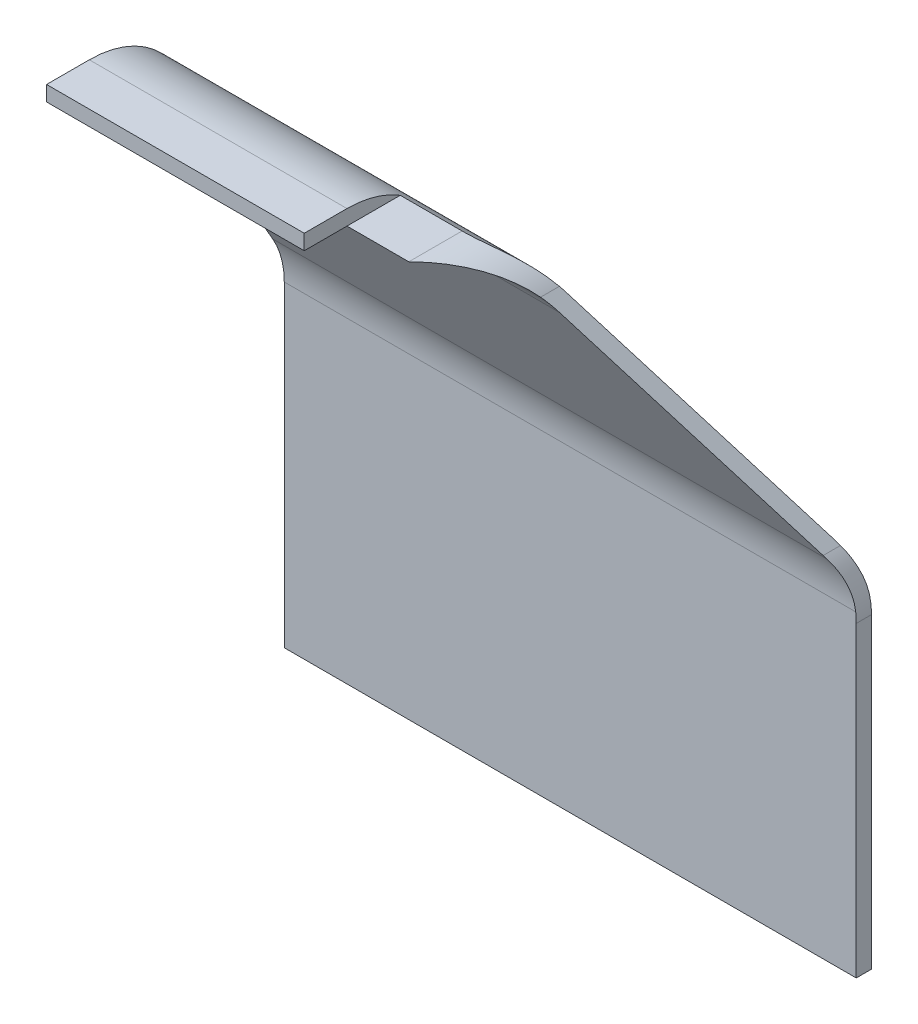
ISO-10303-21;
HEADER;
FILE_DESCRIPTION(('STEP AP214'),'2;1');
FILE_NAME('part.step','',(''),(''),'','','');
FILE_SCHEMA(('AUTOMOTIVE_DESIGN { 1 0 10303 214 1 1 1 1 }'));
ENDSEC;
DATA;
#1=APPLICATION_CONTEXT('core data for automotive mechanical design processes');
#2=APPLICATION_PROTOCOL_DEFINITION('international standard','automotive_design',2000,#1);
#3=PRODUCT_CONTEXT('',#1,'mechanical');
#4=PRODUCT('Part','Part','',(#3));
#5=PRODUCT_RELATED_PRODUCT_CATEGORY('part','',(#4));
#6=PRODUCT_DEFINITION_FORMATION('','',#4);
#7=PRODUCT_DEFINITION_CONTEXT('part definition',#1,'design');
#8=PRODUCT_DEFINITION('design','',#6,#7);
#9=PRODUCT_DEFINITION_SHAPE('','',#8);
#10=(LENGTH_UNIT() NAMED_UNIT(*) SI_UNIT(.MILLI.,.METRE.));
#11=(NAMED_UNIT(*) PLANE_ANGLE_UNIT() SI_UNIT($,.RADIAN.));
#12=(NAMED_UNIT(*) SI_UNIT($,.STERADIAN.) SOLID_ANGLE_UNIT());
#13=UNCERTAINTY_MEASURE_WITH_UNIT(LENGTH_MEASURE(1.E-05),#10,'distance_accuracy_value','');
#14=(GEOMETRIC_REPRESENTATION_CONTEXT(3) GLOBAL_UNCERTAINTY_ASSIGNED_CONTEXT((#13)) GLOBAL_UNIT_ASSIGNED_CONTEXT((#10,
#11,#12)) REPRESENTATION_CONTEXT('',''));
#15=CARTESIAN_POINT('',(0.,0.,0.));
#16=DIRECTION('',(0.,0.,1.));
#17=DIRECTION('',(1.,0.,0.));
#18=AXIS2_PLACEMENT_3D('',#15,#16,#17);
#19=CARTESIAN_POINT('',(58.05,119.961524227066,46.9999999999999));
#20=DIRECTION('',(0.,-1.,0.));
#21=DIRECTION('',(0.,0.,1.));
#22=AXIS2_PLACEMENT_3D('',#19,#20,#21);
#23=PLANE('',#22);
#24=DIRECTION('',(0.,0.,-1.));
#25=VECTOR('',#24,1.);
#26=CARTESIAN_POINT('',(-7.10089581434053,119.961524227066,50.));
#27=LINE('',#26,#25);
#28=CARTESIAN_POINT('',(-7.10089581434053,119.961524227066,46.9999999999999));
#29=VERTEX_POINT('',#28);
#30=CARTESIAN_POINT('',(-7.10089581434053,119.961524227066,38.5470053837924));
#31=VERTEX_POINT('',#30);
#32=EDGE_CURVE('E415',#29,#31,#27,.T.);
#33=ORIENTED_EDGE('',*,*,#32,.T.);
#34=DIRECTION('',(-1.,0.,0.));
#35=VECTOR('',#34,1.);
#36=CARTESIAN_POINT('',(58.05,119.961524227066,38.5470053837924));
#37=LINE('',#36,#35);
#38=CARTESIAN_POINT('',(-58.05,119.961524227066,38.5470053837924));
#39=VERTEX_POINT('',#38);
#40=EDGE_CURVE('E474',#39,#31,#37,.F.);
#41=ORIENTED_EDGE('',*,*,#40,.F.);
#42=DIRECTION('',(0.,0.,-1.));
#43=VECTOR('',#42,1.);
#44=CARTESIAN_POINT('',(-58.05,119.961524227066,46.9999999999999));
#45=LINE('',#44,#43);
#46=CARTESIAN_POINT('',(-58.05,119.961524227066,46.9999999999999));
#47=VERTEX_POINT('',#46);
#48=EDGE_CURVE('E525',#47,#39,#45,.T.);
#49=ORIENTED_EDGE('',*,*,#48,.F.);
#50=DIRECTION('',(-1.,0.,0.));
#51=VECTOR('',#50,1.);
#52=CARTESIAN_POINT('',(58.05,119.961524227066,46.9999999999999));
#53=LINE('',#52,#51);
#54=EDGE_CURVE('E443',#29,#47,#53,.T.);
#55=ORIENTED_EDGE('',*,*,#54,.F.);
#56=EDGE_LOOP('',(#33,#41,#49,#55));
#57=FACE_BOUND('',#56,.T.);
#58=ADVANCED_FACE('F50',(#57),#23,.F.);
#59=CARTESIAN_POINT('',(58.05,0.,0.));
#60=DIRECTION('',(0.,0.,-1.));
#61=DIRECTION('',(1.,0.,0.));
#62=AXIS2_PLACEMENT_3D('',#59,#60,#61);
#63=PLANE('',#62);
#64=DIRECTION('',(0.,1.,0.));
#65=VECTOR('',#64,1.);
#66=CARTESIAN_POINT('',(55.05,0.,0.));
#67=LINE('',#66,#65);
#68=CARTESIAN_POINT('',(55.05,0.,0.));
#69=VERTEX_POINT('',#68);
#70=CARTESIAN_POINT('',(55.05,60.720595314676,0.));
#71=VERTEX_POINT('',#70);
#72=EDGE_CURVE('E431',#69,#71,#67,.T.);
#73=ORIENTED_EDGE('',*,*,#72,.T.);
#74=CARTESIAN_POINT('',(38.05,60.720595314676,0.));
#75=DIRECTION('',(0.,0.,1.));
#76=DIRECTION('',(1.,0.,0.));
#77=AXIS2_PLACEMENT_3D('',#74,#75,#76);
#78=CIRCLE('',#77,17.);
#79=CARTESIAN_POINT('',(54.9411806517473,62.6410161513776,0.));
#80=VERTEX_POINT('',#79);
#81=EDGE_CURVE('E194',#71,#80,#78,.T.);
#82=ORIENTED_EDGE('',*,*,#81,.T.);
#83=DIRECTION('',(-1.,0.,0.));
#84=VECTOR('',#83,1.);
#85=CARTESIAN_POINT('',(58.05,62.6410161513776,0.));
#86=LINE('',#85,#84);
#87=CARTESIAN_POINT('',(-58.05,62.6410161513776,0.));
#88=VERTEX_POINT('',#87);
#89=EDGE_CURVE('E487',#88,#80,#86,.F.);
#90=ORIENTED_EDGE('',*,*,#89,.F.);
#91=DIRECTION('',(0.,1.,0.));
#92=VECTOR('',#91,1.);
#93=CARTESIAN_POINT('',(-58.05,0.,0.));
#94=LINE('',#93,#92);
#95=CARTESIAN_POINT('',(-58.05,0.,0.));
#96=VERTEX_POINT('',#95);
#97=EDGE_CURVE('E514',#96,#88,#94,.T.);
#98=ORIENTED_EDGE('',*,*,#97,.F.);
#99=DIRECTION('',(-1.,0.,0.));
#100=VECTOR('',#99,1.);
#101=CARTESIAN_POINT('',(58.05,0.,0.));
#102=LINE('',#101,#100);
#103=EDGE_CURVE('E454',#69,#96,#102,.T.);
#104=ORIENTED_EDGE('',*,*,#103,.F.);
#105=EDGE_LOOP('',(#73,#82,#90,#98,#104));
#106=FACE_BOUND('',#105,.T.);
#107=ADVANCED_FACE('F257',(#106),#63,.F.);
#108=CARTESIAN_POINT('',(58.05,67.1961524227066,0.));
#109=DIRECTION('',(0.,0.499999999999998,-0.86602540378444));
#110=DIRECTION('',(0.,-0.86602540378444,-0.499999999999998));
#111=AXIS2_PLACEMENT_3D('',#108,#109,#110);
#112=PLANE('',#111);
#113=CARTESIAN_POINT('',(38.05,60.720595314676,-3.73866463947428));
#114=DIRECTION('',(0.,-0.499999999999998,0.86602540378444));
#115=DIRECTION('',(0.,-0.86602540378444,-0.499999999999998));
#116=AXIS2_PLACEMENT_3D('',#113,#114,#115);
#117=ELLIPSE('',#116,19.6299091524473,17.);
#118=CARTESIAN_POINT('',(51.481858753949,71.1410161513775,2.27756813566452));
#119=VERTEX_POINT('',#118);
#120=CARTESIAN_POINT('',(51.0727555330226,71.6479846793471,2.57026655175842));
#121=VERTEX_POINT('',#120);
#122=EDGE_CURVE('E170',#119,#121,#117,.T.);
#123=ORIENTED_EDGE('',*,*,#122,.T.);
#124=DIRECTION('',(-0.587858883152554,0.700582935935479,0.404481746652004));
#125=VECTOR('',#124,1.);
#126=CARTESIAN_POINT('',(55.9285514772247,65.8610724179399,-0.770808800141765));
#127=LINE('',#126,#125);
#128=CARTESIAN_POINT('',(20.1825280762013,108.461524227066,23.8245735194569));
#129=VERTEX_POINT('',#128);
#130=EDGE_CURVE('E178',#121,#129,#127,.T.);
#131=ORIENTED_EDGE('',*,*,#130,.T.);
#132=DIRECTION('',(-1.,0.,0.));
#133=VECTOR('',#132,1.);
#134=CARTESIAN_POINT('',(58.05,108.461524227066,23.8245735194569));
#135=LINE('',#134,#133);
#136=CARTESIAN_POINT('',(-58.05,108.461524227066,23.8245735194569));
#137=VERTEX_POINT('',#136);
#138=EDGE_CURVE('E482',#137,#129,#135,.F.);
#139=ORIENTED_EDGE('',*,*,#138,.F.);
#140=DIRECTION('',(0.,0.86602540378444,0.499999999999998));
#141=VECTOR('',#140,1.);
#142=CARTESIAN_POINT('',(-58.05,67.1961524227066,0.));
#143=LINE('',#142,#141);
#144=CARTESIAN_POINT('',(-58.05,71.1410161513775,2.27756813566452));
#145=VERTEX_POINT('',#144);
#146=EDGE_CURVE('E506',#145,#137,#143,.T.);
#147=ORIENTED_EDGE('',*,*,#146,.F.);
#148=DIRECTION('',(-1.,0.,0.));
#149=VECTOR('',#148,1.);
#150=CARTESIAN_POINT('',(-58.05,71.1410161513775,2.27756813566452));
#151=LINE('',#150,#149);
#152=EDGE_CURVE('E192',#119,#145,#151,.T.);
#153=ORIENTED_EDGE('',*,*,#152,.F.);
#154=EDGE_LOOP('',(#123,#131,#139,#147,#153));
#155=FACE_BOUND('',#154,.T.);
#156=ADVANCED_FACE('F188',(#155),#112,.F.);
#157=CARTESIAN_POINT('',(58.05,116.961524227066,46.9999999999999));
#158=DIRECTION('',(0.,0.,-1.));
#159=DIRECTION('',(0.,-1.,0.));
#160=AXIS2_PLACEMENT_3D('',#157,#158,#159);
#161=PLANE('',#160);
#162=DIRECTION('',(0.,1.,0.));
#163=VECTOR('',#162,1.);
#164=CARTESIAN_POINT('',(-7.10089581434053,116.961524227066,46.9999999999999));
#165=LINE('',#164,#163);
#166=CARTESIAN_POINT('',(-7.10089581434053,116.961524227066,46.9999999999999));
#167=VERTEX_POINT('',#166);
#168=EDGE_CURVE('E407',#167,#29,#165,.T.);
#169=ORIENTED_EDGE('',*,*,#168,.T.);
#170=ORIENTED_EDGE('',*,*,#54,.T.);
#171=DIRECTION('',(0.,1.,0.));
#172=VECTOR('',#171,1.);
#173=CARTESIAN_POINT('',(-58.05,116.961524227066,46.9999999999999));
#174=LINE('',#173,#172);
#175=CARTESIAN_POINT('',(-58.05,116.961524227066,46.9999999999999));
#176=VERTEX_POINT('',#175);
#177=EDGE_CURVE('E517',#176,#47,#174,.T.);
#178=ORIENTED_EDGE('',*,*,#177,.F.);
#179=DIRECTION('',(-1.,0.,0.));
#180=VECTOR('',#179,1.);
#181=CARTESIAN_POINT('',(58.05,116.961524227066,46.9999999999999));
#182=LINE('',#181,#180);
#183=EDGE_CURVE('E446',#167,#176,#182,.T.);
#184=ORIENTED_EDGE('',*,*,#183,.F.);
#185=EDGE_LOOP('',(#169,#170,#178,#184));
#186=FACE_BOUND('',#185,.T.);
#187=ADVANCED_FACE('F267',(#186),#161,.F.);
#188=CARTESIAN_POINT('',(58.05,119.961524227066,26.9999999999999));
#189=DIRECTION('',(0.,-0.499999999999998,0.86602540378444));
#190=DIRECTION('',(0.,0.86602540378444,0.499999999999998));
#191=AXIS2_PLACEMENT_3D('',#188,#189,#190);
#192=PLANE('',#191);
#193=DIRECTION('',(0.587858883152554,-0.700582935935479,-0.404481746652004));
#194=VECTOR('',#193,1.);
#195=CARTESIAN_POINT('',(26.9537559720427,100.391889055923,15.7014658659976));
#196=LINE('',#195,#194);
#197=CARTESIAN_POINT('',(18.9238786294354,109.961524227066,21.2264973081036));
#198=VERTEX_POINT('',#197);
#199=CARTESIAN_POINT('',(50.2395031910945,72.6410161513775,-0.320508075688807));
#200=VERTEX_POINT('',#199);
#201=EDGE_CURVE('E531',#198,#200,#196,.T.);
#202=ORIENTED_EDGE('',*,*,#201,.T.);
#203=DIRECTION('',(-1.,0.,0.));
#204=VECTOR('',#203,1.);
#205=CARTESIAN_POINT('',(58.05,72.6410161513775,-0.320508075688803));
#206=LINE('',#205,#204);
#207=CARTESIAN_POINT('',(-58.05,72.6410161513775,-0.320508075688803));
#208=VERTEX_POINT('',#207);
#209=EDGE_CURVE('E464',#208,#200,#206,.F.);
#210=ORIENTED_EDGE('',*,*,#209,.F.);
#211=DIRECTION('',(0.,-0.86602540378444,-0.499999999999998));
#212=VECTOR('',#211,1.);
#213=CARTESIAN_POINT('',(-58.05,119.961524227066,26.9999999999999));
#214=LINE('',#213,#212);
#215=CARTESIAN_POINT('',(-58.05,109.961524227066,21.2264973081036));
#216=VERTEX_POINT('',#215);
#217=EDGE_CURVE('E448',#216,#208,#214,.T.);
#218=ORIENTED_EDGE('',*,*,#217,.F.);
#219=DIRECTION('',(-1.,0.,0.));
#220=VECTOR('',#219,1.);
#221=CARTESIAN_POINT('',(58.05,109.961524227066,21.2264973081036));
#222=LINE('',#221,#220);
#223=EDGE_CURVE('E469',#198,#216,#222,.T.);
#224=ORIENTED_EDGE('',*,*,#223,.F.);
#225=EDGE_LOOP('',(#202,#210,#218,#224));
#226=FACE_BOUND('',#225,.T.);
#227=ADVANCED_FACE('F270',(#226),#192,.F.);
#228=CARTESIAN_POINT('',(58.05,68.,-3.));
#229=DIRECTION('',(0.,0.,1.));
#230=DIRECTION('',(0.,1.,0.));
#231=AXIS2_PLACEMENT_3D('',#228,#229,#230);
#232=PLANE('',#231);
#233=DIRECTION('',(0.,-1.,0.));
#234=VECTOR('',#233,1.);
#235=CARTESIAN_POINT('',(55.05,68.,-3.));
#236=LINE('',#235,#234);
#237=CARTESIAN_POINT('',(55.05,60.720595314676,-3.));
#238=VERTEX_POINT('',#237);
#239=CARTESIAN_POINT('',(55.05,0.,-3.));
#240=VERTEX_POINT('',#239);
#241=EDGE_CURVE('E11',#238,#240,#236,.T.);
#242=ORIENTED_EDGE('',*,*,#241,.T.);
#243=DIRECTION('',(-1.,0.,0.));
#244=VECTOR('',#243,1.);
#245=CARTESIAN_POINT('',(58.05,0.,-3.));
#246=LINE('',#245,#244);
#247=CARTESIAN_POINT('',(-58.05,0.,-3.));
#248=VERTEX_POINT('',#247);
#249=EDGE_CURVE('E437',#240,#248,#246,.T.);
#250=ORIENTED_EDGE('',*,*,#249,.T.);
#251=DIRECTION('',(0.,-1.,0.));
#252=VECTOR('',#251,1.);
#253=CARTESIAN_POINT('',(-58.05,68.,-3.));
#254=LINE('',#253,#252);
#255=CARTESIAN_POINT('',(-58.05,62.6410161513776,-3.));
#256=VERTEX_POINT('',#255);
#257=EDGE_CURVE('E445',#256,#248,#254,.T.);
#258=ORIENTED_EDGE('',*,*,#257,.F.);
#259=DIRECTION('',(-1.,0.,0.));
#260=VECTOR('',#259,1.);
#261=CARTESIAN_POINT('',(58.05,62.6410161513776,-3.));
#262=LINE('',#261,#260);
#263=CARTESIAN_POINT('',(54.9411806517473,62.6410161513776,-3.));
#264=VERTEX_POINT('',#263);
#265=EDGE_CURVE('E428',#264,#256,#262,.T.);
#266=ORIENTED_EDGE('',*,*,#265,.F.);
#267=CARTESIAN_POINT('',(38.05,60.720595314676,-3.));
#268=DIRECTION('',(0.,0.,-1.));
#269=DIRECTION('',(0.,1.,0.));
#270=AXIS2_PLACEMENT_3D('',#267,#268,#269);
#271=CIRCLE('',#270,17.);
#272=EDGE_CURVE('E213',#264,#238,#271,.T.);
#273=ORIENTED_EDGE('',*,*,#272,.T.);
#274=EDGE_LOOP('',(#242,#250,#258,#266,#273));
#275=FACE_BOUND('',#274,.T.);
#276=ADVANCED_FACE('F225',(#275),#232,.F.);
#277=CARTESIAN_POINT('',(58.05,62.6410161513776,17.));
#278=DIRECTION('',(-1.,0.,0.));
#279=DIRECTION('',(0.,0.,-1.));
#280=AXIS2_PLACEMENT_3D('',#277,#278,#279);
#281=CYLINDRICAL_SURFACE('',#280,20.);
#282=ORIENTED_EDGE('',*,*,#265,.T.);
#283=CARTESIAN_POINT('',(-58.05,62.6410161513776,17.));
#284=DIRECTION('',(-1.,0.,0.));
#285=DIRECTION('',(0.,0.,1.));
#286=AXIS2_PLACEMENT_3D('',#283,#284,#285);
#287=CIRCLE('',#286,20.);
#288=EDGE_CURVE('E459',#256,#208,#287,.F.);
#289=ORIENTED_EDGE('',*,*,#288,.T.);
#290=ORIENTED_EDGE('',*,*,#209,.T.);
#291=CARTESIAN_POINT('',(58.6304995028672,62.6410161513776,17.));
#292=DIRECTION('',(-0.766044443118979,-0.642787609686538,0.));
#293=DIRECTION('',(-0.642787609686538,0.766044443118979,0.));
#294=AXIS2_PLACEMENT_3D('',#291,#292,#293);
#295=ELLIPSE('',#294,26.1081457866455,20.);
#296=CARTESIAN_POINT('',(51.0727555330226,71.6479846793471,-0.85705793058212));
#297=VERTEX_POINT('',#296);
#298=EDGE_CURVE('E534',#297,#200,#295,.F.);
#299=ORIENTED_EDGE('',*,*,#298,.F.);
#300=CARTESIAN_POINT('',(54.9411806517473,62.6410161513776,-3.));
#301=CARTESIAN_POINT('',(54.9170234972303,62.8535184775621,-3.00000357667472));
#302=CARTESIAN_POINT('',(54.8888533776891,63.0655267125537,-2.99661216506532));
#303=CARTESIAN_POINT('',(54.824580195839,63.4881078919754,-2.98317057057549));
#304=CARTESIAN_POINT('',(54.7884777819027,63.6986809522647,-2.97312093179239));
#305=CARTESIAN_POINT('',(54.6685017568662,64.3271201383131,-2.9332129072196));
#306=CARTESIAN_POINT('',(54.5729002888905,64.7422239264023,-2.89359476742512));
#307=CARTESIAN_POINT('',(54.354889800864,65.5497479674667,-2.79142291733916));
#308=CARTESIAN_POINT('',(54.2333006183854,65.9424780050369,-2.72953798450622));
#309=CARTESIAN_POINT('',(53.963458091383,66.7146869614383,-2.58467596176691));
#310=CARTESIAN_POINT('',(53.8152017061546,67.0941643632509,-2.50169646612515));
#311=CARTESIAN_POINT('',(53.4901222962929,67.8462056093782,-2.31475098770334));
#312=CARTESIAN_POINT('',(53.3127193683904,68.2184082416264,-2.21034518681169));
#313=CARTESIAN_POINT('',(52.9338048223089,68.944966690242,-1.98433634559897));
#314=CARTESIAN_POINT('',(52.7322866952215,69.2993176514444,-1.86272866071539));
#315=CARTESIAN_POINT('',(52.3007353728827,69.999095098478,-1.60113655054436));
#316=CARTESIAN_POINT('',(52.0700319862102,70.343942051001,-1.46071289641755));
#317=CARTESIAN_POINT('',(51.5871082370338,71.0121681836264,-1.16747322146933));
#318=CARTESIAN_POINT('',(51.3349071206428,71.3355661143954,-1.01466829107672));
#319=CARTESIAN_POINT('',(51.0727555330226,71.6479846793471,-0.857057930582132));
#320=B_SPLINE_CURVE_WITH_KNOTS('',3,(#300,#301,#302,#303,#304,#305,#306,#307,#308,#309,#310,
#311,#312,#313,#314,#315,#316,#317,#318,#319),.UNSPECIFIED.,.F.,.F.,(4,2,2,2,2,2,2,2,2,4),(0.,
0.641475359483342,1.28289830531581,2.56418783680744,3.80982948115352,5.05561324883391,
6.33012444124597,7.60498041485882,8.917780659416,10.2294177048095),.UNSPECIFIED.);
#321=EDGE_CURVE('E169',#264,#297,#320,.T.);
#322=ORIENTED_EDGE('',*,*,#321,.F.);
#323=EDGE_LOOP('',(#282,#289,#290,#299,#322));
#324=FACE_BOUND('',#323,.T.);
#325=ADVANCED_FACE('F218',(#324),#281,.T.);
#326=CARTESIAN_POINT('',(58.05,99.9615242270664,38.5470053837924));
#327=DIRECTION('',(-1.,0.,0.));
#328=DIRECTION('',(0.,0.,-1.));
#329=AXIS2_PLACEMENT_3D('',#326,#327,#328);
#330=CYLINDRICAL_SURFACE('',#329,20.);
#331=ORIENTED_EDGE('',*,*,#223,.T.);
#332=CARTESIAN_POINT('',(-58.05,99.9615242270664,38.5470053837924));
#333=DIRECTION('',(-1.,0.,0.));
#334=DIRECTION('',(0.,0.,1.));
#335=AXIS2_PLACEMENT_3D('',#332,#333,#334);
#336=CIRCLE('',#335,20.);
#337=EDGE_CURVE('E472',#216,#39,#336,.F.);
#338=ORIENTED_EDGE('',*,*,#337,.T.);
#339=ORIENTED_EDGE('',*,*,#40,.T.);
#340=CARTESIAN_POINT('',(-7.10089581434053,99.9615242270664,38.5470053837924));
#341=DIRECTION('',(-1.,0.,0.));
#342=DIRECTION('',(0.,0.,1.));
#343=AXIS2_PLACEMENT_3D('',#340,#341,#342);
#344=CIRCLE('',#343,20.);
#345=CARTESIAN_POINT('',(-7.10089581434053,116.961524227066,28.0113516309396));
#346=VERTEX_POINT('',#345);
#347=EDGE_CURVE('E420',#346,#31,#344,.F.);
#348=ORIENTED_EDGE('',*,*,#347,.F.);
#349=DIRECTION('',(-1.,0.,0.));
#350=VECTOR('',#349,1.);
#351=CARTESIAN_POINT('',(58.05,116.961524227066,28.0113516309396));
#352=LINE('',#351,#350);
#353=CARTESIAN_POINT('',(5.12295102255945,116.961524227066,28.0113516309396));
#354=VERTEX_POINT('',#353);
#355=EDGE_CURVE('E236',#354,#346,#352,.T.);
#356=ORIENTED_EDGE('',*,*,#355,.F.);
#357=CARTESIAN_POINT('',(18.1457065555821,110.888913591738,21.7961199841225));
#358=CARTESIAN_POINT('',(17.972778249905,111.094989527594,21.9305500909026));
#359=CARTESIAN_POINT('',(17.7956916822672,111.296110651878,22.0671746936421));
#360=CARTESIAN_POINT('',(17.4335630988828,111.688422707841,22.3439978561942));
#361=CARTESIAN_POINT('',(17.2485222902922,111.879615136669,22.4841958723909));
#362=CARTESIAN_POINT('',(16.8707630686193,112.252141856973,22.7674150036979));
#363=CARTESIAN_POINT('',(16.6780434113733,112.433474539579,22.9104365743844));
#364=CARTESIAN_POINT('',(16.2851941285144,112.786266742225,23.1984595090999));
#365=CARTESIAN_POINT('',(16.0850640828763,112.957725701205,23.3434609850562));
#366=CARTESIAN_POINT('',(15.4695930179325,113.460779957492,23.783208531647));
#367=CARTESIAN_POINT('',(15.0430388159945,113.77724324659,24.0797689519088));
#368=CARTESIAN_POINT('',(14.1609366234529,114.369756970441,24.6697794463794));
#369=CARTESIAN_POINT('',(13.7053972946212,114.645819397763,24.9632304195049));
#370=CARTESIAN_POINT('',(12.9212017227899,115.071604165281,25.4416159918224));
#371=CARTESIAN_POINT('',(12.6008861265003,115.232759890445,25.6301074294751));
#372=CARTESIAN_POINT('',(11.9462929490265,115.536252243159,25.9977193918582));
#373=CARTESIAN_POINT('',(11.6120186193218,115.678593221501,26.176842077244));
#374=CARTESIAN_POINT('',(10.9296481350429,115.943259169988,26.5207380242418));
#375=CARTESIAN_POINT('',(10.5815902455362,116.065635304537,26.6855474426579));
#376=CARTESIAN_POINT('',(9.87033250912853,116.289451959786,26.9955852725736));
#377=CARTESIAN_POINT('',(9.50713918016764,116.390901382653,27.1408220010903));
#378=CARTESIAN_POINT('',(8.87348642909958,116.544850276085,27.3663886019316));
#379=CARTESIAN_POINT('',(8.60674938518821,116.603007384816,27.4533154409463));
#380=CARTESIAN_POINT('',(8.06623159738834,116.7070543585,27.6110030083615));
#381=CARTESIAN_POINT('',(7.79245356391383,116.752948868665,27.6817698568695));
#382=CARTESIAN_POINT('',(7.23967723270771,116.831531746706,27.8041872092603));
#383=CARTESIAN_POINT('',(6.96069816814034,116.864261393824,27.8558974229828));
#384=CARTESIAN_POINT('',(6.39846759019982,116.915951578616,27.9380567550627));
#385=CARTESIAN_POINT('',(6.11521932429452,116.934922091385,27.9685212755005));
#386=CARTESIAN_POINT('',(5.71324449035859,116.951682590625,27.9954850388907));
#387=CARTESIAN_POINT('',(5.59532233750887,116.955370293818,28.0014270793891));
#388=CARTESIAN_POINT('',(5.35925618644148,116.960291735124,28.0093623415644));
#389=CARTESIAN_POINT('',(5.24111212890804,116.961524680854,28.011354288172));
#390=CARTESIAN_POINT('',(5.12295102255945,116.961524227066,28.0113516309396));
#391=B_SPLINE_CURVE_WITH_KNOTS('',3,(#357,#358,#359,#360,#361,#362,#363,#364,#365,#366,#367,
#368,#369,#370,#371,#372,#373,#374,#375,#376,#377,#378,#379,#380,#381,#382,#383,#384,#385,#386,
#387,#388,#389,#390),.UNSPECIFIED.,.F.,.F.,(4,2,2,2,2,2,2,2,2,2,2,2,2,2,2,2,4),(0.,
0.902099599215312,1.80406277349486,2.70617268720864,3.6083338115817,5.43110430316127,
7.25333262228904,8.46795030381831,9.68228661941013,10.8934603052038,12.1041176935055,
12.9629603920171,13.821477288406,14.6772808648821,15.5324633791997,15.8867756345306,
16.2412022413564),.UNSPECIFIED.);
#392=CARTESIAN_POINT('',(18.1457065555821,110.888913591738,21.7961199841225));
#393=VERTEX_POINT('',#392);
#394=EDGE_CURVE('E186',#393,#354,#391,.T.);
#395=ORIENTED_EDGE('',*,*,#394,.F.);
#396=CARTESIAN_POINT('',(27.3148749412081,99.9615242270664,38.5470053837924));
#397=DIRECTION('',(-0.766044443118979,-0.642787609686538,0.));
#398=DIRECTION('',(-0.642787609686538,0.766044443118979,0.));
#399=AXIS2_PLACEMENT_3D('',#396,#397,#398);
#400=ELLIPSE('',#399,26.1081457866455,20.);
#401=EDGE_CURVE('E184',#198,#393,#400,.F.);
#402=ORIENTED_EDGE('',*,*,#401,.F.);
#403=EDGE_LOOP('',(#331,#338,#339,#348,#356,#395,#402));
#404=FACE_BOUND('',#403,.T.);
#405=ADVANCED_FACE('F221',(#404),#330,.T.);
#406=CARTESIAN_POINT('',(58.05,99.9615242270664,38.5470053837924));
#407=DIRECTION('',(1.,0.,0.));
#408=DIRECTION('',(0.,0.,1.));
#409=AXIS2_PLACEMENT_3D('',#406,#407,#408);
#410=CYLINDRICAL_SURFACE('',#409,17.);
#411=CARTESIAN_POINT('',(27.3148749412081,99.9615242270664,38.5470053837924));
#412=DIRECTION('',(-0.766044443118979,-0.642787609686538,0.));
#413=DIRECTION('',(0.642787609686538,-0.766044443118979,0.));
#414=AXIS2_PLACEMENT_3D('',#411,#412,#413);
#415=ELLIPSE('',#414,22.1919239186487,17.);
#416=CARTESIAN_POINT('',(18.1457065555821,110.888913591738,25.5242498507698));
#417=VERTEX_POINT('',#416);
#418=EDGE_CURVE('E60',#129,#417,#415,.F.);
#419=ORIENTED_EDGE('',*,*,#418,.T.);
#420=CARTESIAN_POINT('',(5.12295102255945,99.9615242270664,38.5470053837924));
#421=DIRECTION('',(-0.707106781186547,0.,-0.707106781186547));
#422=DIRECTION('',(0.707106781186547,0.,-0.707106781186547));
#423=AXIS2_PLACEMENT_3D('',#420,#421,#422);
#424=ELLIPSE('',#423,24.0416305603426,17.);
#425=CARTESIAN_POINT('',(5.12295102255945,116.961524227066,38.5470053837924));
#426=VERTEX_POINT('',#425);
#427=EDGE_CURVE('E501',#417,#426,#424,.F.);
#428=ORIENTED_EDGE('',*,*,#427,.T.);
#429=DIRECTION('',(-1.,0.,0.));
#430=VECTOR('',#429,1.);
#431=CARTESIAN_POINT('',(-58.05,116.961524227066,38.5470053837924));
#432=LINE('',#431,#430);
#433=CARTESIAN_POINT('',(-7.10089581434053,116.961524227066,38.5470053837924));
#434=VERTEX_POINT('',#433);
#435=EDGE_CURVE('E483',#426,#434,#432,.T.);
#436=ORIENTED_EDGE('',*,*,#435,.T.);
#437=CARTESIAN_POINT('',(-58.05,116.961524227066,38.5470053837924));
#438=VERTEX_POINT('',#437);
#439=EDGE_CURVE('E479',#434,#438,#432,.T.);
#440=ORIENTED_EDGE('',*,*,#439,.T.);
#441=CARTESIAN_POINT('',(-58.05,99.9615242270664,38.5470053837924));
#442=DIRECTION('',(-1.,0.,0.));
#443=DIRECTION('',(0.,0.,1.));
#444=AXIS2_PLACEMENT_3D('',#441,#442,#443);
#445=CIRCLE('',#444,17.);
#446=EDGE_CURVE('E484',#438,#137,#445,.T.);
#447=ORIENTED_EDGE('',*,*,#446,.T.);
#448=ORIENTED_EDGE('',*,*,#138,.T.);
#449=EDGE_LOOP('',(#419,#428,#436,#440,#447,#448));
#450=FACE_BOUND('',#449,.T.);
#451=ADVANCED_FACE('F228',(#450),#410,.F.);
#452=CARTESIAN_POINT('',(58.05,62.6410161513776,17.));
#453=DIRECTION('',(1.,0.,0.));
#454=DIRECTION('',(0.,0.,1.));
#455=AXIS2_PLACEMENT_3D('',#452,#453,#454);
#456=CYLINDRICAL_SURFACE('',#455,17.);
#457=CARTESIAN_POINT('',(54.9411806517473,62.6410161513776,0.));
#458=CARTESIAN_POINT('',(54.9184382254402,62.8410778656383,-3.28174206131976E-06));
#459=CARTESIAN_POINT('',(54.892137936733,63.0406983104257,0.00353262128909707));
#460=CARTESIAN_POINT('',(54.8325141446345,63.4386241561322,0.0175548554111907));
#461=CARTESIAN_POINT('',(54.7991912830339,63.636929675515,0.0280405515504049));
#462=CARTESIAN_POINT('',(54.6889161896901,64.2287656530385,0.0696952404371729));
#463=CARTESIAN_POINT('',(54.6015977232604,64.6197387489289,0.111062512932446));
#464=CARTESIAN_POINT('',(54.4034946007314,65.3803662258866,0.217883145646495));
#465=CARTESIAN_POINT('',(54.2934315122346,65.7503110806001,0.282633335977358));
#466=CARTESIAN_POINT('',(54.0500578327233,66.4777880431861,0.434455797684511));
#467=CARTESIAN_POINT('',(53.9167442835716,66.8353185646439,0.521530910106096));
#468=CARTESIAN_POINT('',(53.6250423660015,67.5447338879187,0.718339130426747));
#469=CARTESIAN_POINT('',(53.466106568663,67.8962491097505,0.828588125593773));
#470=CARTESIAN_POINT('',(53.1276366254354,68.5826150776642,1.06797038015978));
#471=CARTESIAN_POINT('',(52.9480963166759,68.9174607946847,1.19710929277729));
#472=CARTESIAN_POINT('',(52.5647350001669,69.5790950473409,1.47596172577744));
#473=CARTESIAN_POINT('',(52.3603482866846,69.9053428539206,1.62617518769987));
#474=CARTESIAN_POINT('',(51.9339098658808,70.5380531029711,1.9413906006558));
#475=CARTESIAN_POINT('',(51.7118761693912,70.8445351542652,2.10637749489704));
#476=CARTESIAN_POINT('',(51.481858753949,71.1410161513775,2.27756813566451));
#477=B_SPLINE_CURVE_WITH_KNOTS('',3,(#457,#458,#459,#460,#461,#462,#463,#464,#465,#466,#467,
#468,#469,#470,#471,#472,#473,#474,#475,#476),.UNSPECIFIED.,.F.,.F.,(4,2,2,2,2,2,2,2,2,4),(0.,
0.603917425499735,1.20777968308954,2.41393127787175,3.58647843572831,4.7591748847892,
5.96143624875916,7.16405815452336,8.40265831934531,9.6400101911576),.UNSPECIFIED.);
#478=EDGE_CURVE('E61',#80,#119,#477,.T.);
#479=ORIENTED_EDGE('',*,*,#478,.T.);
#480=ORIENTED_EDGE('',*,*,#152,.T.);
#481=CARTESIAN_POINT('',(-58.05,62.6410161513776,17.));
#482=DIRECTION('',(-1.,0.,0.));
#483=DIRECTION('',(0.,0.,1.));
#484=AXIS2_PLACEMENT_3D('',#481,#482,#483);
#485=CIRCLE('',#484,17.);
#486=EDGE_CURVE('E72',#145,#88,#485,.T.);
#487=ORIENTED_EDGE('',*,*,#486,.T.);
#488=ORIENTED_EDGE('',*,*,#89,.T.);
#489=EDGE_LOOP('',(#479,#480,#487,#488));
#490=FACE_BOUND('',#489,.T.);
#491=ADVANCED_FACE('F47',(#490),#456,.F.);
#492=CARTESIAN_POINT('',(58.05,0.,-3.));
#493=DIRECTION('',(0.,1.,0.));
#494=DIRECTION('',(0.,0.,-1.));
#495=AXIS2_PLACEMENT_3D('',#492,#493,#494);
#496=PLANE('',#495);
#497=ORIENTED_EDGE('',*,*,#103,.T.);
#498=DIRECTION('',(0.,0.,1.));
#499=VECTOR('',#498,1.);
#500=CARTESIAN_POINT('',(-58.05,0.,-3.));
#501=LINE('',#500,#499);
#502=EDGE_CURVE('E436',#248,#96,#501,.T.);
#503=ORIENTED_EDGE('',*,*,#502,.F.);
#504=ORIENTED_EDGE('',*,*,#249,.F.);
#505=DIRECTION('',(0.,0.,-1.));
#506=VECTOR('',#505,1.);
#507=CARTESIAN_POINT('',(55.05,0.,50.));
#508=LINE('',#507,#506);
#509=EDGE_CURVE('E191',#69,#240,#508,.T.);
#510=ORIENTED_EDGE('',*,*,#509,.F.);
#511=EDGE_LOOP('',(#497,#503,#504,#510));
#512=FACE_BOUND('',#511,.T.);
#513=ADVANCED_FACE('F222',(#512),#496,.F.);
#514=CARTESIAN_POINT('',(58.05,116.961524227066,28.7320508075687));
#515=DIRECTION('',(0.,1.,0.));
#516=DIRECTION('',(0.,0.,-1.));
#517=AXIS2_PLACEMENT_3D('',#514,#515,#516);
#518=PLANE('',#517);
#519=ORIENTED_EDGE('',*,*,#183,.T.);
#520=DIRECTION('',(0.,0.,1.));
#521=VECTOR('',#520,1.);
#522=CARTESIAN_POINT('',(-58.05,116.961524227066,28.7320508075687));
#523=LINE('',#522,#521);
#524=EDGE_CURVE('E512',#438,#176,#523,.T.);
#525=ORIENTED_EDGE('',*,*,#524,.F.);
#526=ORIENTED_EDGE('',*,*,#439,.F.);
#527=DIRECTION('',(0.,0.,-1.));
#528=VECTOR('',#527,1.);
#529=CARTESIAN_POINT('',(-7.10089581434053,116.961524227066,50.));
#530=LINE('',#529,#528);
#531=EDGE_CURVE('E409',#167,#434,#530,.T.);
#532=ORIENTED_EDGE('',*,*,#531,.F.);
#533=EDGE_LOOP('',(#519,#525,#526,#532));
#534=FACE_BOUND('',#533,.T.);
#535=ADVANCED_FACE('F273',(#534),#518,.F.);
#536=CARTESIAN_POINT('',(-58.05,0.,0.));
#537=DIRECTION('',(1.,0.,0.));
#538=DIRECTION('',(0.,0.,1.));
#539=AXIS2_PLACEMENT_3D('',#536,#537,#538);
#540=PLANE('',#539);
#541=ORIENTED_EDGE('',*,*,#217,.T.);
#542=ORIENTED_EDGE('',*,*,#288,.F.);
#543=ORIENTED_EDGE('',*,*,#257,.T.);
#544=ORIENTED_EDGE('',*,*,#502,.T.);
#545=ORIENTED_EDGE('',*,*,#97,.T.);
#546=ORIENTED_EDGE('',*,*,#486,.F.);
#547=ORIENTED_EDGE('',*,*,#146,.T.);
#548=ORIENTED_EDGE('',*,*,#446,.F.);
#549=ORIENTED_EDGE('',*,*,#524,.T.);
#550=ORIENTED_EDGE('',*,*,#177,.T.);
#551=ORIENTED_EDGE('',*,*,#48,.T.);
#552=ORIENTED_EDGE('',*,*,#337,.F.);
#553=EDGE_LOOP('',(#541,#542,#543,#544,#545,#546,#547,#548,#549,#550,#551,#552));
#554=FACE_BOUND('',#553,.T.);
#555=ADVANCED_FACE('F251',(#554),#540,.F.);
#556=CARTESIAN_POINT('',(55.05,0.,50.));
#557=DIRECTION('',(1.,0.,0.));
#558=DIRECTION('',(0.,0.,1.));
#559=AXIS2_PLACEMENT_3D('',#556,#557,#558);
#560=PLANE('',#559);
#561=ORIENTED_EDGE('',*,*,#72,.F.);
#562=ORIENTED_EDGE('',*,*,#509,.T.);
#563=ORIENTED_EDGE('',*,*,#241,.F.);
#564=DIRECTION('',(0.,0.,-1.));
#565=VECTOR('',#564,1.);
#566=CARTESIAN_POINT('',(55.05,60.720595314676,50.));
#567=LINE('',#566,#565);
#568=EDGE_CURVE('E174',#71,#238,#567,.T.);
#569=ORIENTED_EDGE('',*,*,#568,.F.);
#570=EDGE_LOOP('',(#561,#562,#563,#569));
#571=FACE_BOUND('',#570,.T.);
#572=ADVANCED_FACE('F248',(#571),#560,.T.);
#573=CARTESIAN_POINT('',(51.0727555330226,71.6479846793471,50.));
#574=DIRECTION('',(0.766044443118979,0.642787609686538,0.));
#575=DIRECTION('',(-0.642787609686538,0.766044443118979,0.));
#576=AXIS2_PLACEMENT_3D('',#573,#574,#575);
#577=PLANE('',#576);
#578=DIRECTION('',(0.,0.,-1.));
#579=VECTOR('',#578,1.);
#580=CARTESIAN_POINT('',(51.0727555330226,71.6479846793471,50.));
#581=LINE('',#580,#579);
#582=EDGE_CURVE('E161',#121,#297,#581,.T.);
#583=ORIENTED_EDGE('',*,*,#582,.T.);
#584=ORIENTED_EDGE('',*,*,#298,.T.);
#585=ORIENTED_EDGE('',*,*,#201,.F.);
#586=ORIENTED_EDGE('',*,*,#401,.T.);
#587=DIRECTION('',(0.,0.,-1.));
#588=VECTOR('',#587,1.);
#589=CARTESIAN_POINT('',(18.1457065555821,110.888913591738,50.));
#590=LINE('',#589,#588);
#591=EDGE_CURVE('E172',#417,#393,#590,.T.);
#592=ORIENTED_EDGE('',*,*,#591,.F.);
#593=ORIENTED_EDGE('',*,*,#418,.F.);
#594=ORIENTED_EDGE('',*,*,#130,.F.);
#595=EDGE_LOOP('',(#583,#584,#585,#586,#592,#593,#594));
#596=FACE_BOUND('',#595,.T.);
#597=ADVANCED_FACE('F177',(#596),#577,.T.);
#598=CARTESIAN_POINT('',(5.12295102255945,99.9615242270664,50.));
#599=DIRECTION('',(0.,0.,-1.));
#600=DIRECTION('',(1.,0.,0.));
#601=AXIS2_PLACEMENT_3D('',#598,#599,#600);
#602=CYLINDRICAL_SURFACE('',#601,17.);
#603=ORIENTED_EDGE('',*,*,#591,.T.);
#604=ORIENTED_EDGE('',*,*,#394,.T.);
#605=DIRECTION('',(0.,0.,-1.));
#606=VECTOR('',#605,1.);
#607=CARTESIAN_POINT('',(5.12295102255945,116.961524227066,50.));
#608=LINE('',#607,#606);
#609=EDGE_CURVE('E545',#426,#354,#608,.T.);
#610=ORIENTED_EDGE('',*,*,#609,.F.);
#611=ORIENTED_EDGE('',*,*,#427,.F.);
#612=EDGE_LOOP('',(#603,#604,#610,#611));
#613=FACE_BOUND('',#612,.T.);
#614=ADVANCED_FACE('F244',(#613),#602,.T.);
#615=CARTESIAN_POINT('',(5.12295102255945,116.961524227066,50.));
#616=DIRECTION('',(0.,1.,0.));
#617=DIRECTION('',(0.,0.,-1.));
#618=AXIS2_PLACEMENT_3D('',#615,#616,#617);
#619=PLANE('',#618);
#620=ORIENTED_EDGE('',*,*,#435,.F.);
#621=ORIENTED_EDGE('',*,*,#609,.T.);
#622=ORIENTED_EDGE('',*,*,#355,.T.);
#623=EDGE_CURVE('E544',#434,#346,#530,.T.);
#624=ORIENTED_EDGE('',*,*,#623,.F.);
#625=EDGE_LOOP('',(#620,#621,#622,#624));
#626=FACE_BOUND('',#625,.T.);
#627=ADVANCED_FACE('F247',(#626),#619,.T.);
#628=CARTESIAN_POINT('',(-7.10089581434053,116.961524227066,50.));
#629=DIRECTION('',(1.,0.,0.));
#630=DIRECTION('',(0.,0.,1.));
#631=AXIS2_PLACEMENT_3D('',#628,#629,#630);
#632=PLANE('',#631);
#633=ORIENTED_EDGE('',*,*,#168,.F.);
#634=ORIENTED_EDGE('',*,*,#531,.T.);
#635=ORIENTED_EDGE('',*,*,#623,.T.);
#636=ORIENTED_EDGE('',*,*,#347,.T.);
#637=ORIENTED_EDGE('',*,*,#32,.F.);
#638=EDGE_LOOP('',(#633,#634,#635,#636,#637));
#639=FACE_BOUND('',#638,.T.);
#640=ADVANCED_FACE('F368',(#639),#632,.T.);
#641=CARTESIAN_POINT('',(38.05,60.720595314676,50.));
#642=DIRECTION('',(0.,0.,-1.));
#643=DIRECTION('',(1.,0.,0.));
#644=AXIS2_PLACEMENT_3D('',#641,#642,#643);
#645=CYLINDRICAL_SURFACE('',#644,17.);
#646=ORIENTED_EDGE('',*,*,#272,.F.);
#647=ORIENTED_EDGE('',*,*,#321,.T.);
#648=ORIENTED_EDGE('',*,*,#582,.F.);
#649=ORIENTED_EDGE('',*,*,#122,.F.);
#650=ORIENTED_EDGE('',*,*,#478,.F.);
#651=ORIENTED_EDGE('',*,*,#81,.F.);
#652=ORIENTED_EDGE('',*,*,#568,.T.);
#653=EDGE_LOOP('',(#646,#647,#648,#649,#650,#651,#652));
#654=FACE_BOUND('',#653,.T.);
#655=ADVANCED_FACE('F167',(#654),#645,.T.);
#656=CLOSED_SHELL('',(#58,#107,#156,#187,#227,#276,#325,#405,#451,#491,#513,#535,#555,#572,#597,
#614,#627,#640,#655));
#657=MANIFOLD_SOLID_BREP('B2',#656);
#658=ADVANCED_BREP_SHAPE_REPRESENTATION('',(#18,#657),#14);
#659=SHAPE_DEFINITION_REPRESENTATION(#9,#658);
ENDSEC;
END-ISO-10303-21;
